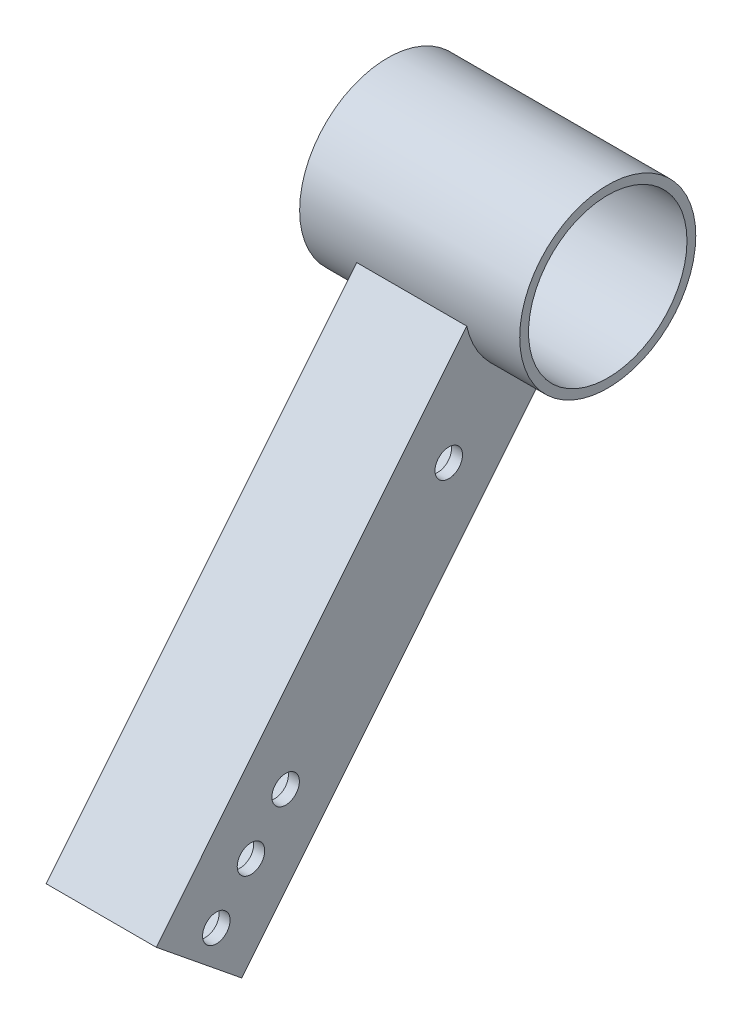
ISO-10303-21;
HEADER;
FILE_DESCRIPTION(('STEP AP214'),'2;1');
FILE_NAME('part.step','',(''),(''),'','','');
FILE_SCHEMA(('AUTOMOTIVE_DESIGN { 1 0 10303 214 1 1 1 1 }'));
ENDSEC;
DATA;
#1=APPLICATION_CONTEXT('core data for automotive mechanical design processes');
#2=APPLICATION_PROTOCOL_DEFINITION('international standard','automotive_design',2000,#1);
#3=PRODUCT_CONTEXT('',#1,'mechanical');
#4=PRODUCT('Part','Part','',(#3));
#5=PRODUCT_RELATED_PRODUCT_CATEGORY('part','',(#4));
#6=PRODUCT_DEFINITION_FORMATION('','',#4);
#7=PRODUCT_DEFINITION_CONTEXT('part definition',#1,'design');
#8=PRODUCT_DEFINITION('design','',#6,#7);
#9=PRODUCT_DEFINITION_SHAPE('','',#8);
#10=(LENGTH_UNIT() NAMED_UNIT(*) SI_UNIT(.MILLI.,.METRE.));
#11=(NAMED_UNIT(*) PLANE_ANGLE_UNIT() SI_UNIT($,.RADIAN.));
#12=(NAMED_UNIT(*) SI_UNIT($,.STERADIAN.) SOLID_ANGLE_UNIT());
#13=UNCERTAINTY_MEASURE_WITH_UNIT(LENGTH_MEASURE(1.E-05),#10,'distance_accuracy_value','');
#14=(GEOMETRIC_REPRESENTATION_CONTEXT(3) GLOBAL_UNCERTAINTY_ASSIGNED_CONTEXT((#13)) GLOBAL_UNIT_ASSIGNED_CONTEXT((#10,
#11,#12)) REPRESENTATION_CONTEXT('',''));
#15=CARTESIAN_POINT('',(0.,0.,0.));
#16=DIRECTION('',(0.,0.,1.));
#17=DIRECTION('',(1.,0.,0.));
#18=AXIS2_PLACEMENT_3D('',#15,#16,#17);
#19=CARTESIAN_POINT('',(0.,46.5993514723731,-37.7955082298709));
#20=DIRECTION('',(0.,-0.776655857872885,0.629925137164515));
#21=DIRECTION('',(0.,-0.629925137164515,-0.776655857872885));
#22=AXIS2_PLACEMENT_3D('',#19,#20,#21);
#23=PLANE('',#22);
#24=DIRECTION('',(0.,0.629925137164515,0.776655857872885));
#25=VECTOR('',#24,1.);
#26=CARTESIAN_POINT('',(-10.,40.3001001007279,-45.5620668085997));
#27=LINE('',#26,#25);
#28=CARTESIAN_POINT('',(-10.,40.3001001007279,-45.5620668085997));
#29=VERTEX_POINT('',#28);
#30=CARTESIAN_POINT('',(-10.,52.8986028440182,-30.028949651142));
#31=VERTEX_POINT('',#30);
#32=EDGE_CURVE('E154',#29,#31,#27,.T.);
#33=ORIENTED_EDGE('',*,*,#32,.F.);
#34=DIRECTION('',(-1.,0.,0.));
#35=VECTOR('',#34,1.);
#36=CARTESIAN_POINT('',(10.,40.3001001007279,-45.5620668085997));
#37=LINE('',#36,#35);
#38=CARTESIAN_POINT('',(10.,40.3001001007279,-45.5620668085997));
#39=VERTEX_POINT('',#38);
#40=EDGE_CURVE('E163',#39,#29,#37,.T.);
#41=ORIENTED_EDGE('',*,*,#40,.F.);
#42=DIRECTION('',(0.,-0.629925137164515,-0.776655857872885));
#43=VECTOR('',#42,1.);
#44=CARTESIAN_POINT('',(10.,40.3001001007279,-45.5620668085997));
#45=LINE('',#44,#43);
#46=CARTESIAN_POINT('',(10.,52.8986028440182,-30.028949651142));
#47=VERTEX_POINT('',#46);
#48=EDGE_CURVE('E160',#47,#39,#45,.T.);
#49=ORIENTED_EDGE('',*,*,#48,.F.);
#50=DIRECTION('',(1.,0.,0.));
#51=VECTOR('',#50,1.);
#52=CARTESIAN_POINT('',(10.,52.8986028440182,-30.028949651142));
#53=LINE('',#52,#51);
#54=EDGE_CURVE('E157',#31,#47,#53,.T.);
#55=ORIENTED_EDGE('',*,*,#54,.F.);
#56=EDGE_LOOP('',(#33,#41,#49,#55));
#57=FACE_BOUND('',#56,.T.);
#58=DIRECTION('',(0.,-0.629925137164515,-0.776655857872885));
#59=VECTOR('',#58,1.);
#60=CARTESIAN_POINT('',(8.,41.559950375057,-44.008755092854));
#61=LINE('',#60,#59);
#62=CARTESIAN_POINT('',(8.,51.6387525696892,-31.5822613668878));
#63=VERTEX_POINT('',#62);
#64=CARTESIAN_POINT('',(8.,41.559950375057,-44.008755092854));
#65=VERTEX_POINT('',#64);
#66=EDGE_CURVE('E108',#63,#65,#61,.T.);
#67=ORIENTED_EDGE('',*,*,#66,.T.);
#68=DIRECTION('',(-1.,0.,0.));
#69=VECTOR('',#68,1.);
#70=CARTESIAN_POINT('',(8.,41.559950375057,-44.008755092854));
#71=LINE('',#70,#69);
#72=CARTESIAN_POINT('',(-8.,41.559950375057,-44.008755092854));
#73=VERTEX_POINT('',#72);
#74=EDGE_CURVE('E141',#65,#73,#71,.T.);
#75=ORIENTED_EDGE('',*,*,#74,.T.);
#76=DIRECTION('',(0.,0.629925137164515,0.776655857872885));
#77=VECTOR('',#76,1.);
#78=CARTESIAN_POINT('',(-8.,41.559950375057,-44.008755092854));
#79=LINE('',#78,#77);
#80=CARTESIAN_POINT('',(-8.,51.6387525696892,-31.5822613668878));
#81=VERTEX_POINT('',#80);
#82=EDGE_CURVE('E144',#73,#81,#79,.T.);
#83=ORIENTED_EDGE('',*,*,#82,.T.);
#84=DIRECTION('',(1.,0.,0.));
#85=VECTOR('',#84,1.);
#86=CARTESIAN_POINT('',(8.,51.6387525696892,-31.5822613668878));
#87=LINE('',#86,#85);
#88=EDGE_CURVE('E147',#81,#63,#87,.T.);
#89=ORIENTED_EDGE('',*,*,#88,.T.);
#90=EDGE_LOOP('',(#67,#75,#83,#89));
#91=FACE_BOUND('',#90,.T.);
#92=ADVANCED_FACE('F41',(#57,#91),#23,.T.);
#93=CARTESIAN_POINT('',(-10.,96.2666147884179,-90.9550347285469));
#94=DIRECTION('',(1.,0.,0.));
#95=DIRECTION('',(0.,0.,-1.));
#96=AXIS2_PLACEMENT_3D('',#93,#94,#95);
#97=PLANE('',#96);
#98=CARTESIAN_POINT('',(-10.,102.565866160063,-83.1884761498181));
#99=DIRECTION('',(1.,0.,0.));
#100=DIRECTION('',(0.,0.,-1.));
#101=AXIS2_PLACEMENT_3D('',#98,#99,#100);
#102=CIRCLE('',#101,2.5);
#103=CARTESIAN_POINT('',(-10.,102.565866160063,-85.6884761498181));
#104=VERTEX_POINT('',#103);
#105=EDGE_CURVE('E185',#104,#104,#102,.T.);
#106=ORIENTED_EDGE('',*,*,#105,.T.);
#107=EDGE_LOOP('',(#106));
#108=FACE_BOUND('',#107,.T.);
#109=CARTESIAN_POINT('',(-10.,50.4826307617375,-40.9451339156935));
#110=DIRECTION('',(1.,0.,0.));
#111=DIRECTION('',(0.,0.,-1.));
#112=AXIS2_PLACEMENT_3D('',#109,#110,#111);
#113=CIRCLE('',#112,2.5);
#114=CARTESIAN_POINT('',(-10.,50.4826307617375,-43.4451339156935));
#115=VERTEX_POINT('',#114);
#116=EDGE_CURVE('E181',#115,#115,#113,.T.);
#117=ORIENTED_EDGE('',*,*,#116,.T.);
#118=EDGE_LOOP('',(#117));
#119=FACE_BOUND('',#118,.T.);
#120=CARTESIAN_POINT('',(-10.,58.2491893404664,-47.2443852873386));
#121=DIRECTION('',(1.,0.,0.));
#122=DIRECTION('',(0.,0.,-1.));
#123=AXIS2_PLACEMENT_3D('',#120,#121,#122);
#124=CIRCLE('',#123,2.5);
#125=CARTESIAN_POINT('',(-10.,58.2491893404664,-49.7443852873386));
#126=VERTEX_POINT('',#125);
#127=EDGE_CURVE('E177',#126,#126,#124,.T.);
#128=ORIENTED_EDGE('',*,*,#127,.T.);
#129=EDGE_LOOP('',(#128));
#130=FACE_BOUND('',#129,.T.);
#131=CARTESIAN_POINT('',(-10.,66.0157479191953,-53.5436366589838));
#132=DIRECTION('',(1.,0.,0.));
#133=DIRECTION('',(0.,0.,-1.));
#134=AXIS2_PLACEMENT_3D('',#131,#132,#133);
#135=CIRCLE('',#134,2.5);
#136=CARTESIAN_POINT('',(-10.,66.0157479191953,-56.0436366589838));
#137=VERTEX_POINT('',#136);
#138=EDGE_CURVE('E216',#137,#137,#135,.T.);
#139=ORIENTED_EDGE('',*,*,#138,.T.);
#140=EDGE_LOOP('',(#139));
#141=FACE_BOUND('',#140,.T.);
#142=DIRECTION('',(0.,-0.776655857872885,0.629925137164515));
#143=VECTOR('',#142,1.);
#144=CARTESIAN_POINT('',(-10.,108.865117531708,-75.4219175710892));
#145=LINE('',#144,#143);
#146=CARTESIAN_POINT('',(-10.,122.464364712174,-86.4519092445582));
#147=VERTEX_POINT('',#146);
#148=EDGE_CURVE('E50',#147,#31,#145,.T.);
#149=ORIENTED_EDGE('',*,*,#148,.F.);
#150=CARTESIAN_POINT('',(-10.,125.86554189625,-102.086230264753));
#151=DIRECTION('',(1.,0.,0.));
#152=DIRECTION('',(0.,0.,-1.));
#153=AXIS2_PLACEMENT_3D('',#150,#151,#152);
#154=CIRCLE('',#153,16.0000000000001);
#155=CARTESIAN_POINT('',(-10.,109.865861968883,-101.985026402016));
#156=VERTEX_POINT('',#155);
#157=EDGE_CURVE('E138',#147,#156,#154,.T.);
#158=ORIENTED_EDGE('',*,*,#157,.T.);
#159=DIRECTION('',(0.,-0.776655857872885,0.629925137164515));
#160=VECTOR('',#159,1.);
#161=CARTESIAN_POINT('',(-10.,96.2666147884179,-90.9550347285469));
#162=LINE('',#161,#160);
#163=EDGE_CURVE('E166',#156,#29,#162,.T.);
#164=ORIENTED_EDGE('',*,*,#163,.T.);
#165=ORIENTED_EDGE('',*,*,#32,.T.);
#166=EDGE_LOOP('',(#149,#158,#164,#165));
#167=FACE_BOUND('',#166,.T.);
#168=ADVANCED_FACE('F43',(#108,#119,#130,#141,#167),#97,.F.);
#169=CARTESIAN_POINT('',(10.,108.865117531708,-75.4219175710892));
#170=DIRECTION('',(0.,-0.629925137164515,-0.776655857872885));
#171=DIRECTION('',(0.,0.776655857872885,-0.629925137164515));
#172=AXIS2_PLACEMENT_3D('',#169,#170,#171);
#173=PLANE('',#172);
#174=DIRECTION('',(0.,-0.776655857872885,0.629925137164515));
#175=VECTOR('',#174,1.);
#176=CARTESIAN_POINT('',(10.,108.865117531708,-75.4219175710892));
#177=LINE('',#176,#175);
#178=CARTESIAN_POINT('',(10.,122.464364712174,-86.4519092445582));
#179=VERTEX_POINT('',#178);
#180=EDGE_CURVE('E170',#179,#47,#177,.T.);
#181=ORIENTED_EDGE('',*,*,#180,.F.);
#182=DIRECTION('',(1.,0.,0.));
#183=VECTOR('',#182,1.);
#184=CARTESIAN_POINT('',(-12.5,122.464364712174,-86.4519092445582));
#185=LINE('',#184,#183);
#186=EDGE_CURVE('E135',#179,#147,#185,.F.);
#187=ORIENTED_EDGE('',*,*,#186,.T.);
#188=ORIENTED_EDGE('',*,*,#148,.T.);
#189=ORIENTED_EDGE('',*,*,#54,.T.);
#190=EDGE_LOOP('',(#181,#187,#188,#189));
#191=FACE_BOUND('',#190,.T.);
#192=ADVANCED_FACE('F262',(#191),#173,.F.);
#193=CARTESIAN_POINT('',(10.,96.2666147884179,-90.9550347285469));
#194=DIRECTION('',(-1.,0.,0.));
#195=DIRECTION('',(0.,0.,1.));
#196=AXIS2_PLACEMENT_3D('',#193,#194,#195);
#197=PLANE('',#196);
#198=CARTESIAN_POINT('',(10.,102.565866160063,-83.1884761498181));
#199=DIRECTION('',(1.,0.,0.));
#200=DIRECTION('',(0.,0.,-1.));
#201=AXIS2_PLACEMENT_3D('',#198,#199,#200);
#202=CIRCLE('',#201,2.5);
#203=CARTESIAN_POINT('',(10.,102.565866160063,-85.6884761498181));
#204=VERTEX_POINT('',#203);
#205=EDGE_CURVE('E357',#204,#204,#202,.T.);
#206=ORIENTED_EDGE('',*,*,#205,.F.);
#207=EDGE_LOOP('',(#206));
#208=FACE_BOUND('',#207,.T.);
#209=CARTESIAN_POINT('',(10.,50.4826307617375,-40.9451339156935));
#210=DIRECTION('',(-1.,0.,0.));
#211=DIRECTION('',(0.,0.,1.));
#212=AXIS2_PLACEMENT_3D('',#209,#210,#211);
#213=CIRCLE('',#212,2.5);
#214=CARTESIAN_POINT('',(10.,50.4826307617375,-38.4451339156935));
#215=VERTEX_POINT('',#214);
#216=EDGE_CURVE('E189',#215,#215,#213,.T.);
#217=ORIENTED_EDGE('',*,*,#216,.T.);
#218=EDGE_LOOP('',(#217));
#219=FACE_BOUND('',#218,.T.);
#220=CARTESIAN_POINT('',(10.,58.2491893404664,-47.2443852873386));
#221=DIRECTION('',(-1.,0.,0.));
#222=DIRECTION('',(0.,0.,1.));
#223=AXIS2_PLACEMENT_3D('',#220,#221,#222);
#224=CIRCLE('',#223,2.5);
#225=CARTESIAN_POINT('',(10.,58.2491893404664,-44.7443852873386));
#226=VERTEX_POINT('',#225);
#227=EDGE_CURVE('E206',#226,#226,#224,.T.);
#228=ORIENTED_EDGE('',*,*,#227,.T.);
#229=EDGE_LOOP('',(#228));
#230=FACE_BOUND('',#229,.T.);
#231=CARTESIAN_POINT('',(10.,66.0157479191953,-53.5436366589838));
#232=DIRECTION('',(-1.,0.,0.));
#233=DIRECTION('',(0.,0.,1.));
#234=AXIS2_PLACEMENT_3D('',#231,#232,#233);
#235=CIRCLE('',#234,2.5);
#236=CARTESIAN_POINT('',(10.,66.0157479191953,-51.0436366589838));
#237=VERTEX_POINT('',#236);
#238=EDGE_CURVE('E213',#237,#237,#235,.T.);
#239=ORIENTED_EDGE('',*,*,#238,.T.);
#240=EDGE_LOOP('',(#239));
#241=FACE_BOUND('',#240,.T.);
#242=DIRECTION('',(0.,-0.776655857872885,0.629925137164515));
#243=VECTOR('',#242,1.);
#244=CARTESIAN_POINT('',(10.,96.2666147884179,-90.9550347285469));
#245=LINE('',#244,#243);
#246=CARTESIAN_POINT('',(10.,109.865861968883,-101.985026402016));
#247=VERTEX_POINT('',#246);
#248=EDGE_CURVE('E168',#247,#39,#245,.T.);
#249=ORIENTED_EDGE('',*,*,#248,.F.);
#250=CARTESIAN_POINT('',(10.,125.86554189625,-102.086230264753));
#251=DIRECTION('',(-1.,0.,0.));
#252=DIRECTION('',(0.,0.,1.));
#253=AXIS2_PLACEMENT_3D('',#250,#251,#252);
#254=CIRCLE('',#253,16.0000000000001);
#255=EDGE_CURVE('E58',#247,#179,#254,.T.);
#256=ORIENTED_EDGE('',*,*,#255,.T.);
#257=ORIENTED_EDGE('',*,*,#180,.T.);
#258=ORIENTED_EDGE('',*,*,#48,.T.);
#259=EDGE_LOOP('',(#249,#256,#257,#258));
#260=FACE_BOUND('',#259,.T.);
#261=ADVANCED_FACE('F272',(#208,#219,#230,#241,#260),#197,.F.);
#262=CARTESIAN_POINT('',(10.,96.2666147884179,-90.9550347285469));
#263=DIRECTION('',(0.,0.629925137164515,0.776655857872885));
#264=DIRECTION('',(0.,-0.776655857872885,0.629925137164515));
#265=AXIS2_PLACEMENT_3D('',#262,#263,#264);
#266=PLANE('',#265);
#267=ORIENTED_EDGE('',*,*,#163,.F.);
#268=DIRECTION('',(1.,0.,0.));
#269=VECTOR('',#268,1.);
#270=CARTESIAN_POINT('',(-12.5,109.865861968883,-101.985026402016));
#271=LINE('',#270,#269);
#272=EDGE_CURVE('E129',#156,#247,#271,.T.);
#273=ORIENTED_EDGE('',*,*,#272,.T.);
#274=ORIENTED_EDGE('',*,*,#248,.T.);
#275=ORIENTED_EDGE('',*,*,#40,.T.);
#276=EDGE_LOOP('',(#267,#273,#274,#275));
#277=FACE_BOUND('',#276,.T.);
#278=ADVANCED_FACE('F269',(#277),#266,.F.);
#279=CARTESIAN_POINT('',(8.,97.5264650627469,-89.4017230128012));
#280=DIRECTION('',(0.,0.629925137164515,0.776655857872885));
#281=DIRECTION('',(0.,-0.776655857872885,0.629925137164515));
#282=AXIS2_PLACEMENT_3D('',#279,#280,#281);
#283=PLANE('',#282);
#284=DIRECTION('',(1.,0.,0.));
#285=VECTOR('',#284,1.);
#286=CARTESIAN_POINT('',(-12.5,110.064481552279,-99.5709783874667));
#287=LINE('',#286,#285);
#288=CARTESIAN_POINT('',(-8.,110.064481552279,-99.5709783874667));
#289=VERTEX_POINT('',#288);
#290=CARTESIAN_POINT('',(8.,110.064481552279,-99.5709783874667));
#291=VERTEX_POINT('',#290);
#292=EDGE_CURVE('E126',#289,#291,#287,.T.);
#293=ORIENTED_EDGE('',*,*,#292,.F.);
#294=DIRECTION('',(0.,-0.776655857872885,0.629925137164515));
#295=VECTOR('',#294,1.);
#296=CARTESIAN_POINT('',(-8.,97.5264650627469,-89.4017230128012));
#297=LINE('',#296,#295);
#298=EDGE_CURVE('E152',#289,#73,#297,.T.);
#299=ORIENTED_EDGE('',*,*,#298,.T.);
#300=ORIENTED_EDGE('',*,*,#74,.F.);
#301=DIRECTION('',(0.,-0.776655857872885,0.629925137164515));
#302=VECTOR('',#301,1.);
#303=CARTESIAN_POINT('',(8.,97.5264650627469,-89.4017230128012));
#304=LINE('',#303,#302);
#305=EDGE_CURVE('E113',#291,#65,#304,.T.);
#306=ORIENTED_EDGE('',*,*,#305,.F.);
#307=EDGE_LOOP('',(#293,#299,#300,#306));
#308=FACE_BOUND('',#307,.T.);
#309=ADVANCED_FACE('F267',(#308),#283,.T.);
#310=CARTESIAN_POINT('',(-8.,97.5264650627469,-89.4017230128012));
#311=DIRECTION('',(1.,0.,0.));
#312=DIRECTION('',(0.,0.,-1.));
#313=AXIS2_PLACEMENT_3D('',#310,#311,#312);
#314=PLANE('',#313);
#315=CARTESIAN_POINT('',(-8.,102.565866160063,-83.1884761498181));
#316=DIRECTION('',(1.,0.,0.));
#317=DIRECTION('',(0.,0.,-1.));
#318=AXIS2_PLACEMENT_3D('',#315,#316,#317);
#319=CIRCLE('',#318,2.5);
#320=CARTESIAN_POINT('',(-8.,102.565866160063,-85.6884761498181));
#321=VERTEX_POINT('',#320);
#322=EDGE_CURVE('E192',#321,#321,#319,.T.);
#323=ORIENTED_EDGE('',*,*,#322,.F.);
#324=EDGE_LOOP('',(#323));
#325=FACE_BOUND('',#324,.T.);
#326=CARTESIAN_POINT('',(-8.,50.4826307617375,-40.9451339156935));
#327=DIRECTION('',(1.,0.,0.));
#328=DIRECTION('',(0.,0.,-1.));
#329=AXIS2_PLACEMENT_3D('',#326,#327,#328);
#330=CIRCLE('',#329,2.5);
#331=CARTESIAN_POINT('',(-8.,50.4826307617375,-43.4451339156935));
#332=VERTEX_POINT('',#331);
#333=EDGE_CURVE('E184',#332,#332,#330,.T.);
#334=ORIENTED_EDGE('',*,*,#333,.F.);
#335=EDGE_LOOP('',(#334));
#336=FACE_BOUND('',#335,.T.);
#337=CARTESIAN_POINT('',(-8.,58.2491893404664,-47.2443852873386));
#338=DIRECTION('',(1.,0.,0.));
#339=DIRECTION('',(0.,0.,-1.));
#340=AXIS2_PLACEMENT_3D('',#337,#338,#339);
#341=CIRCLE('',#340,2.5);
#342=CARTESIAN_POINT('',(-8.,58.2491893404664,-49.7443852873386));
#343=VERTEX_POINT('',#342);
#344=EDGE_CURVE('E180',#343,#343,#341,.T.);
#345=ORIENTED_EDGE('',*,*,#344,.F.);
#346=EDGE_LOOP('',(#345));
#347=FACE_BOUND('',#346,.T.);
#348=CARTESIAN_POINT('',(-8.,66.0157479191953,-53.5436366589838));
#349=DIRECTION('',(1.,0.,0.));
#350=DIRECTION('',(0.,0.,-1.));
#351=AXIS2_PLACEMENT_3D('',#348,#349,#350);
#352=CIRCLE('',#351,2.5);
#353=CARTESIAN_POINT('',(-8.,66.0157479191953,-56.0436366589838));
#354=VERTEX_POINT('',#353);
#355=EDGE_CURVE('E176',#354,#354,#352,.T.);
#356=ORIENTED_EDGE('',*,*,#355,.F.);
#357=EDGE_LOOP('',(#356));
#358=FACE_BOUND('',#357,.T.);
#359=CARTESIAN_POINT('',(-8.,125.86554189625,-102.086230264753));
#360=DIRECTION('',(1.,0.,0.));
#361=DIRECTION('',(0.,0.,-1.));
#362=AXIS2_PLACEMENT_3D('',#359,#360,#361);
#363=CIRCLE('',#362,16.0000000000001);
#364=CARTESIAN_POINT('',(-8.,120.143283746911,-87.1444846615005));
#365=VERTEX_POINT('',#364);
#366=EDGE_CURVE('E121',#365,#289,#363,.T.);
#367=ORIENTED_EDGE('',*,*,#366,.F.);
#368=DIRECTION('',(0.,-0.776655857872885,0.629925137164515));
#369=VECTOR('',#368,1.);
#370=CARTESIAN_POINT('',(-8.,107.605267257379,-76.975229286835));
#371=LINE('',#370,#369);
#372=EDGE_CURVE('E112',#365,#81,#371,.T.);
#373=ORIENTED_EDGE('',*,*,#372,.T.);
#374=ORIENTED_EDGE('',*,*,#82,.F.);
#375=ORIENTED_EDGE('',*,*,#298,.F.);
#376=EDGE_LOOP('',(#367,#373,#374,#375));
#377=FACE_BOUND('',#376,.T.);
#378=ADVANCED_FACE('F304',(#325,#336,#347,#358,#377),#314,.T.);
#379=CARTESIAN_POINT('',(8.,107.605267257379,-76.975229286835));
#380=DIRECTION('',(0.,-0.629925137164515,-0.776655857872885));
#381=DIRECTION('',(0.,0.776655857872885,-0.629925137164515));
#382=AXIS2_PLACEMENT_3D('',#379,#380,#381);
#383=PLANE('',#382);
#384=DIRECTION('',(1.,0.,0.));
#385=VECTOR('',#384,1.);
#386=CARTESIAN_POINT('',(-12.5,120.143283746911,-87.1444846615005));
#387=LINE('',#386,#385);
#388=CARTESIAN_POINT('',(8.,120.143283746911,-87.1444846615005));
#389=VERTEX_POINT('',#388);
#390=EDGE_CURVE('E117',#389,#365,#387,.F.);
#391=ORIENTED_EDGE('',*,*,#390,.F.);
#392=DIRECTION('',(0.,-0.776655857872885,0.629925137164515));
#393=VECTOR('',#392,1.);
#394=CARTESIAN_POINT('',(8.,107.605267257379,-76.975229286835));
#395=LINE('',#394,#393);
#396=EDGE_CURVE('E104',#389,#63,#395,.T.);
#397=ORIENTED_EDGE('',*,*,#396,.T.);
#398=ORIENTED_EDGE('',*,*,#88,.F.);
#399=ORIENTED_EDGE('',*,*,#372,.F.);
#400=EDGE_LOOP('',(#391,#397,#398,#399));
#401=FACE_BOUND('',#400,.T.);
#402=ADVANCED_FACE('F118',(#401),#383,.T.);
#403=CARTESIAN_POINT('',(8.,97.5264650627469,-89.4017230128012));
#404=DIRECTION('',(-1.,0.,0.));
#405=DIRECTION('',(0.,0.,1.));
#406=AXIS2_PLACEMENT_3D('',#403,#404,#405);
#407=PLANE('',#406);
#408=CARTESIAN_POINT('',(8.,102.565866160063,-83.1884761498181));
#409=DIRECTION('',(-1.,0.,0.));
#410=DIRECTION('',(0.,0.,1.));
#411=AXIS2_PLACEMENT_3D('',#408,#409,#410);
#412=CIRCLE('',#411,2.5);
#413=CARTESIAN_POINT('',(8.,102.565866160063,-80.6884761498181));
#414=VERTEX_POINT('',#413);
#415=EDGE_CURVE('E45',#414,#414,#412,.T.);
#416=ORIENTED_EDGE('',*,*,#415,.F.);
#417=EDGE_LOOP('',(#416));
#418=FACE_BOUND('',#417,.T.);
#419=CARTESIAN_POINT('',(8.,50.4826307617375,-40.9451339156935));
#420=DIRECTION('',(-1.,0.,0.));
#421=DIRECTION('',(0.,0.,1.));
#422=AXIS2_PLACEMENT_3D('',#419,#420,#421);
#423=CIRCLE('',#422,2.5);
#424=CARTESIAN_POINT('',(8.,50.4826307617375,-38.4451339156935));
#425=VERTEX_POINT('',#424);
#426=EDGE_CURVE('E182',#425,#425,#423,.T.);
#427=ORIENTED_EDGE('',*,*,#426,.F.);
#428=EDGE_LOOP('',(#427));
#429=FACE_BOUND('',#428,.T.);
#430=CARTESIAN_POINT('',(8.,58.2491893404664,-47.2443852873386));
#431=DIRECTION('',(-1.,0.,0.));
#432=DIRECTION('',(0.,0.,1.));
#433=AXIS2_PLACEMENT_3D('',#430,#431,#432);
#434=CIRCLE('',#433,2.5);
#435=CARTESIAN_POINT('',(8.,58.2491893404664,-44.7443852873386));
#436=VERTEX_POINT('',#435);
#437=EDGE_CURVE('E178',#436,#436,#434,.T.);
#438=ORIENTED_EDGE('',*,*,#437,.F.);
#439=EDGE_LOOP('',(#438));
#440=FACE_BOUND('',#439,.T.);
#441=CARTESIAN_POINT('',(8.,66.0157479191953,-53.5436366589838));
#442=DIRECTION('',(-1.,0.,0.));
#443=DIRECTION('',(0.,0.,1.));
#444=AXIS2_PLACEMENT_3D('',#441,#442,#443);
#445=CIRCLE('',#444,2.5);
#446=CARTESIAN_POINT('',(8.,66.0157479191953,-51.0436366589838));
#447=VERTEX_POINT('',#446);
#448=EDGE_CURVE('E173',#447,#447,#445,.T.);
#449=ORIENTED_EDGE('',*,*,#448,.F.);
#450=EDGE_LOOP('',(#449));
#451=FACE_BOUND('',#450,.T.);
#452=CARTESIAN_POINT('',(8.,125.86554189625,-102.086230264753));
#453=DIRECTION('',(-1.,0.,0.));
#454=DIRECTION('',(0.,0.,1.));
#455=AXIS2_PLACEMENT_3D('',#452,#453,#454);
#456=CIRCLE('',#455,16.0000000000001);
#457=EDGE_CURVE('E11',#291,#389,#456,.T.);
#458=ORIENTED_EDGE('',*,*,#457,.F.);
#459=ORIENTED_EDGE('',*,*,#305,.T.);
#460=ORIENTED_EDGE('',*,*,#66,.F.);
#461=ORIENTED_EDGE('',*,*,#396,.F.);
#462=EDGE_LOOP('',(#458,#459,#460,#461));
#463=FACE_BOUND('',#462,.T.);
#464=ADVANCED_FACE('F106',(#418,#429,#440,#451,#463),#407,.T.);
#465=CARTESIAN_POINT('',(20.,125.86554189625,-102.086230264753));
#466=DIRECTION('',(-1.,0.,0.));
#467=DIRECTION('',(0.,0.,1.));
#468=AXIS2_PLACEMENT_3D('',#465,#466,#467);
#469=CYLINDRICAL_SURFACE('',#468,16.0000000000001);
#470=ORIENTED_EDGE('',*,*,#292,.T.);
#471=ORIENTED_EDGE('',*,*,#457,.T.);
#472=ORIENTED_EDGE('',*,*,#390,.T.);
#473=ORIENTED_EDGE('',*,*,#366,.T.);
#474=EDGE_LOOP('',(#470,#471,#472,#473));
#475=FACE_BOUND('',#474,.T.);
#476=ADVANCED_FACE('F125',(#475),#469,.T.);
#477=CARTESIAN_POINT('',(-20.,125.86554189625,-102.086230264753));
#478=DIRECTION('',(1.,0.,0.));
#479=DIRECTION('',(0.,0.,-1.));
#480=AXIS2_PLACEMENT_3D('',#477,#478,#479);
#481=CIRCLE('',#480,16.0000000000001);
#482=CARTESIAN_POINT('',(-20.,125.86554189625,-118.086230264754));
#483=VERTEX_POINT('',#482);
#484=EDGE_CURVE('E223',#483,#483,#481,.T.);
#485=ORIENTED_EDGE('',*,*,#484,.T.);
#486=EDGE_LOOP('',(#485));
#487=FACE_BOUND('',#486,.T.);
#488=CARTESIAN_POINT('',(20.,125.86554189625,-102.086230264753));
#489=DIRECTION('',(1.,0.,0.));
#490=DIRECTION('',(0.,0.,-1.));
#491=AXIS2_PLACEMENT_3D('',#488,#489,#490);
#492=CIRCLE('',#491,16.0000000000001);
#493=CARTESIAN_POINT('',(20.,125.86554189625,-118.086230264754));
#494=VERTEX_POINT('',#493);
#495=EDGE_CURVE('E122',#494,#494,#492,.T.);
#496=ORIENTED_EDGE('',*,*,#495,.F.);
#497=EDGE_LOOP('',(#496));
#498=FACE_BOUND('',#497,.T.);
#499=ORIENTED_EDGE('',*,*,#272,.F.);
#500=ORIENTED_EDGE('',*,*,#157,.F.);
#501=ORIENTED_EDGE('',*,*,#186,.F.);
#502=ORIENTED_EDGE('',*,*,#255,.F.);
#503=EDGE_LOOP('',(#499,#500,#501,#502));
#504=FACE_BOUND('',#503,.T.);
#505=ADVANCED_FACE('F231',(#487,#498,#504),#469,.T.);
#506=CARTESIAN_POINT('',(20.,125.86554189625,-102.086230264753));
#507=DIRECTION('',(1.,0.,0.));
#508=DIRECTION('',(0.,0.,-1.));
#509=AXIS2_PLACEMENT_3D('',#506,#507,#508);
#510=PLANE('',#509);
#511=ORIENTED_EDGE('',*,*,#495,.T.);
#512=EDGE_LOOP('',(#511));
#513=FACE_BOUND('',#512,.T.);
#514=CARTESIAN_POINT('',(20.,125.86554189625,-102.086230264753));
#515=DIRECTION('',(1.,0.,0.));
#516=DIRECTION('',(0.,0.,-1.));
#517=AXIS2_PLACEMENT_3D('',#514,#515,#516);
#518=CIRCLE('',#517,14.4);
#519=CARTESIAN_POINT('',(20.,125.86554189625,-116.486230264754));
#520=VERTEX_POINT('',#519);
#521=EDGE_CURVE('E220',#520,#520,#518,.T.);
#522=ORIENTED_EDGE('',*,*,#521,.F.);
#523=EDGE_LOOP('',(#522));
#524=FACE_BOUND('',#523,.T.);
#525=ADVANCED_FACE('F238',(#513,#524),#510,.T.);
#526=CARTESIAN_POINT('',(-20.,125.86554189625,-102.086230264753));
#527=DIRECTION('',(1.,0.,0.));
#528=DIRECTION('',(0.,0.,-1.));
#529=AXIS2_PLACEMENT_3D('',#526,#527,#528);
#530=PLANE('',#529);
#531=ORIENTED_EDGE('',*,*,#484,.F.);
#532=EDGE_LOOP('',(#531));
#533=FACE_BOUND('',#532,.T.);
#534=CARTESIAN_POINT('',(-20.,125.86554189625,-102.086230264753));
#535=DIRECTION('',(1.,0.,0.));
#536=DIRECTION('',(0.,0.,-1.));
#537=AXIS2_PLACEMENT_3D('',#534,#535,#536);
#538=CIRCLE('',#537,14.4);
#539=CARTESIAN_POINT('',(-20.,125.86554189625,-116.486230264754));
#540=VERTEX_POINT('',#539);
#541=EDGE_CURVE('E219',#540,#540,#538,.T.);
#542=ORIENTED_EDGE('',*,*,#541,.T.);
#543=EDGE_LOOP('',(#542));
#544=FACE_BOUND('',#543,.T.);
#545=ADVANCED_FACE('F234',(#533,#544),#530,.F.);
#546=CARTESIAN_POINT('',(20.,125.86554189625,-102.086230264753));
#547=DIRECTION('',(-1.,0.,0.));
#548=DIRECTION('',(0.,0.,1.));
#549=AXIS2_PLACEMENT_3D('',#546,#547,#548);
#550=CYLINDRICAL_SURFACE('',#549,14.4);
#551=ORIENTED_EDGE('',*,*,#521,.T.);
#552=EDGE_LOOP('',(#551));
#553=FACE_BOUND('',#552,.T.);
#554=ORIENTED_EDGE('',*,*,#541,.F.);
#555=EDGE_LOOP('',(#554));
#556=FACE_BOUND('',#555,.T.);
#557=ADVANCED_FACE('F237',(#553,#556),#550,.F.);
#558=CARTESIAN_POINT('',(-20.,66.0157479191953,-53.5436366589838));
#559=DIRECTION('',(1.,0.,0.));
#560=DIRECTION('',(0.,0.,-1.));
#561=AXIS2_PLACEMENT_3D('',#558,#559,#560);
#562=CYLINDRICAL_SURFACE('',#561,2.5);
#563=ORIENTED_EDGE('',*,*,#448,.T.);
#564=EDGE_LOOP('',(#563));
#565=FACE_BOUND('',#564,.T.);
#566=ORIENTED_EDGE('',*,*,#238,.F.);
#567=EDGE_LOOP('',(#566));
#568=FACE_BOUND('',#567,.T.);
#569=ADVANCED_FACE('F243',(#565,#568),#562,.F.);
#570=ORIENTED_EDGE('',*,*,#355,.T.);
#571=EDGE_LOOP('',(#570));
#572=FACE_BOUND('',#571,.T.);
#573=ORIENTED_EDGE('',*,*,#138,.F.);
#574=EDGE_LOOP('',(#573));
#575=FACE_BOUND('',#574,.T.);
#576=ADVANCED_FACE('F250',(#572,#575),#562,.F.);
#577=CARTESIAN_POINT('',(-20.,58.2491893404664,-47.2443852873386));
#578=DIRECTION('',(1.,0.,0.));
#579=DIRECTION('',(0.,0.,-1.));
#580=AXIS2_PLACEMENT_3D('',#577,#578,#579);
#581=CYLINDRICAL_SURFACE('',#580,2.5);
#582=ORIENTED_EDGE('',*,*,#437,.T.);
#583=EDGE_LOOP('',(#582));
#584=FACE_BOUND('',#583,.T.);
#585=ORIENTED_EDGE('',*,*,#227,.F.);
#586=EDGE_LOOP('',(#585));
#587=FACE_BOUND('',#586,.T.);
#588=ADVANCED_FACE('F325',(#584,#587),#581,.F.);
#589=ORIENTED_EDGE('',*,*,#344,.T.);
#590=EDGE_LOOP('',(#589));
#591=FACE_BOUND('',#590,.T.);
#592=ORIENTED_EDGE('',*,*,#127,.F.);
#593=EDGE_LOOP('',(#592));
#594=FACE_BOUND('',#593,.T.);
#595=ADVANCED_FACE('F332',(#591,#594),#581,.F.);
#596=CARTESIAN_POINT('',(-20.,50.4826307617375,-40.9451339156935));
#597=DIRECTION('',(1.,0.,0.));
#598=DIRECTION('',(0.,0.,-1.));
#599=AXIS2_PLACEMENT_3D('',#596,#597,#598);
#600=CYLINDRICAL_SURFACE('',#599,2.5);
#601=ORIENTED_EDGE('',*,*,#426,.T.);
#602=EDGE_LOOP('',(#601));
#603=FACE_BOUND('',#602,.T.);
#604=ORIENTED_EDGE('',*,*,#216,.F.);
#605=EDGE_LOOP('',(#604));
#606=FACE_BOUND('',#605,.T.);
#607=ADVANCED_FACE('F337',(#603,#606),#600,.F.);
#608=ORIENTED_EDGE('',*,*,#333,.T.);
#609=EDGE_LOOP('',(#608));
#610=FACE_BOUND('',#609,.T.);
#611=ORIENTED_EDGE('',*,*,#116,.F.);
#612=EDGE_LOOP('',(#611));
#613=FACE_BOUND('',#612,.T.);
#614=ADVANCED_FACE('F339',(#610,#613),#600,.F.);
#615=CARTESIAN_POINT('',(-15.,102.565866160063,-83.1884761498181));
#616=DIRECTION('',(1.,0.,0.));
#617=DIRECTION('',(0.,0.,-1.));
#618=AXIS2_PLACEMENT_3D('',#615,#616,#617);
#619=CYLINDRICAL_SURFACE('',#618,2.5);
#620=ORIENTED_EDGE('',*,*,#415,.T.);
#621=EDGE_LOOP('',(#620));
#622=FACE_BOUND('',#621,.T.);
#623=ORIENTED_EDGE('',*,*,#205,.T.);
#624=EDGE_LOOP('',(#623));
#625=FACE_BOUND('',#624,.T.);
#626=ADVANCED_FACE('F342',(#622,#625),#619,.F.);
#627=ORIENTED_EDGE('',*,*,#322,.T.);
#628=EDGE_LOOP('',(#627));
#629=FACE_BOUND('',#628,.T.);
#630=ORIENTED_EDGE('',*,*,#105,.F.);
#631=EDGE_LOOP('',(#630));
#632=FACE_BOUND('',#631,.T.);
#633=ADVANCED_FACE('F345',(#629,#632),#619,.F.);
#634=CLOSED_SHELL('',(#92,#168,#192,#261,#278,#309,#378,#402,#464,#476,#505,#525,#545,#557,#569,
#576,#588,#595,#607,#614,#626,#633));
#635=MANIFOLD_SOLID_BREP('B2',#634);
#636=ADVANCED_BREP_SHAPE_REPRESENTATION('',(#18,#635),#14);
#637=SHAPE_DEFINITION_REPRESENTATION(#9,#636);
ENDSEC;
END-ISO-10303-21;
